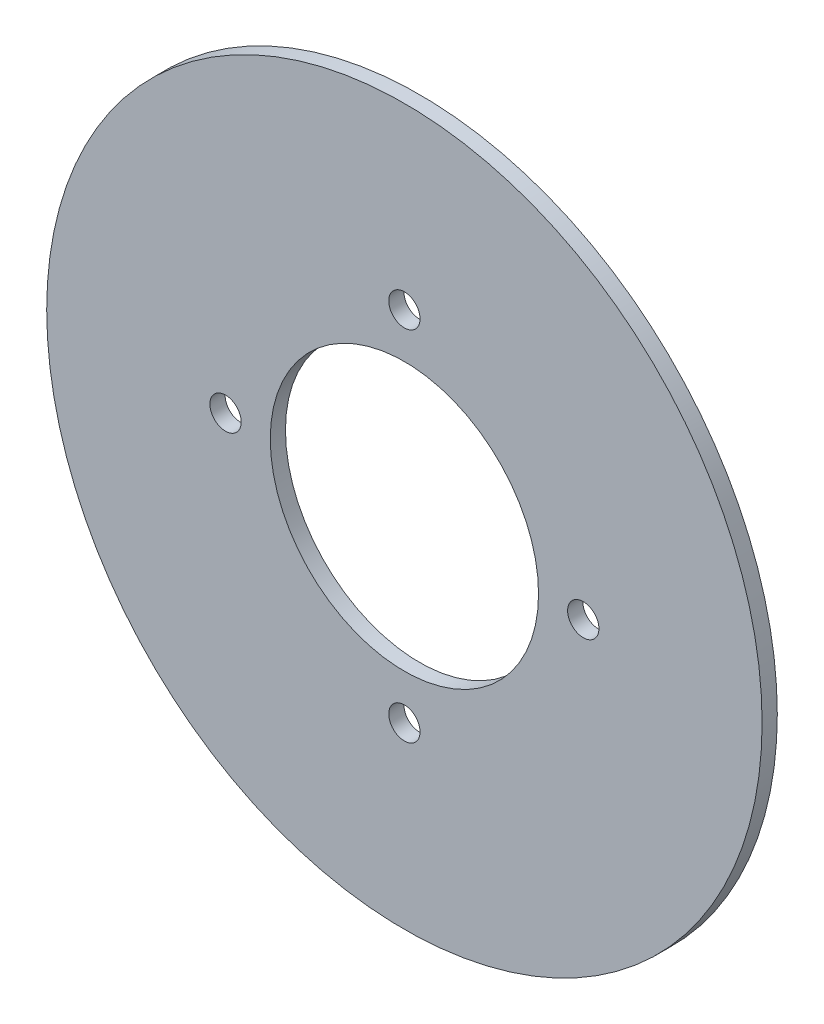
ISO-10303-21;
HEADER;
FILE_DESCRIPTION(('STEP AP214'),'2;1');
FILE_NAME('part.step','',(''),(''),'','','');
FILE_SCHEMA(('AUTOMOTIVE_DESIGN { 1 0 10303 214 1 1 1 1 }'));
ENDSEC;
DATA;
#1=APPLICATION_CONTEXT('core data for automotive mechanical design processes');
#2=APPLICATION_PROTOCOL_DEFINITION('international standard','automotive_design',2000,#1);
#3=PRODUCT_CONTEXT('',#1,'mechanical');
#4=PRODUCT('Part','Part','',(#3));
#5=PRODUCT_RELATED_PRODUCT_CATEGORY('part','',(#4));
#6=PRODUCT_DEFINITION_FORMATION('','',#4);
#7=PRODUCT_DEFINITION_CONTEXT('part definition',#1,'design');
#8=PRODUCT_DEFINITION('design','',#6,#7);
#9=PRODUCT_DEFINITION_SHAPE('','',#8);
#10=(LENGTH_UNIT() NAMED_UNIT(*) SI_UNIT(.MILLI.,.METRE.));
#11=(NAMED_UNIT(*) PLANE_ANGLE_UNIT() SI_UNIT($,.RADIAN.));
#12=(NAMED_UNIT(*) SI_UNIT($,.STERADIAN.) SOLID_ANGLE_UNIT());
#13=UNCERTAINTY_MEASURE_WITH_UNIT(LENGTH_MEASURE(1.E-05),#10,'distance_accuracy_value','');
#14=(GEOMETRIC_REPRESENTATION_CONTEXT(3) GLOBAL_UNCERTAINTY_ASSIGNED_CONTEXT((#13)) GLOBAL_UNIT_ASSIGNED_CONTEXT((#10,
#11,#12)) REPRESENTATION_CONTEXT('',''));
#15=CARTESIAN_POINT('',(0.,0.,0.));
#16=DIRECTION('',(0.,0.,1.));
#17=DIRECTION('',(1.,0.,0.));
#18=AXIS2_PLACEMENT_3D('',#15,#16,#17);
#19=CARTESIAN_POINT('',(0.,0.,1.7));
#20=DIRECTION('',(0.,0.,1.));
#21=DIRECTION('',(1.,0.,0.));
#22=AXIS2_PLACEMENT_3D('',#19,#20,#21);
#23=PLANE('',#22);
#24=CARTESIAN_POINT('',(1.13196979001957E-12,-20.,1.7));
#25=DIRECTION('',(0.,0.,1.));
#26=DIRECTION('',(1.,0.,0.));
#27=AXIS2_PLACEMENT_3D('',#24,#25,#26);
#28=CIRCLE('',#27,1.75000000000122);
#29=CARTESIAN_POINT('',(1.75000000000235,-20.,1.7));
#30=VERTEX_POINT('',#29);
#31=EDGE_CURVE('E61',#30,#30,#28,.T.);
#32=ORIENTED_EDGE('',*,*,#31,.F.);
#33=EDGE_LOOP('',(#32));
#34=FACE_BOUND('',#33,.T.);
#35=CARTESIAN_POINT('',(0.,20.,1.7));
#36=DIRECTION('',(0.,0.,1.));
#37=DIRECTION('',(1.,0.,0.));
#38=AXIS2_PLACEMENT_3D('',#35,#36,#37);
#39=CIRCLE('',#38,1.75);
#40=CARTESIAN_POINT('',(1.75,20.,1.7));
#41=VERTEX_POINT('',#40);
#42=EDGE_CURVE('E49',#41,#41,#39,.T.);
#43=ORIENTED_EDGE('',*,*,#42,.F.);
#44=EDGE_LOOP('',(#43));
#45=FACE_BOUND('',#44,.T.);
#46=CARTESIAN_POINT('',(0.,0.,1.7));
#47=DIRECTION('',(0.,0.,1.));
#48=DIRECTION('',(1.,0.,0.));
#49=AXIS2_PLACEMENT_3D('',#46,#47,#48);
#50=CIRCLE('',#49,40.);
#51=CARTESIAN_POINT('',(40.,0.,1.7));
#52=VERTEX_POINT('',#51);
#53=EDGE_CURVE('E10',#52,#52,#50,.T.);
#54=ORIENTED_EDGE('',*,*,#53,.T.);
#55=EDGE_LOOP('',(#54));
#56=FACE_BOUND('',#55,.T.);
#57=CARTESIAN_POINT('',(0.,0.,1.7));
#58=DIRECTION('',(0.,0.,1.));
#59=DIRECTION('',(1.,0.,0.));
#60=AXIS2_PLACEMENT_3D('',#57,#58,#59);
#61=CIRCLE('',#60,15.);
#62=CARTESIAN_POINT('',(15.,0.,1.7));
#63=VERTEX_POINT('',#62);
#64=EDGE_CURVE('E44',#63,#63,#61,.T.);
#65=ORIENTED_EDGE('',*,*,#64,.F.);
#66=EDGE_LOOP('',(#65));
#67=FACE_BOUND('',#66,.T.);
#68=CARTESIAN_POINT('',(20.,0.,1.7));
#69=DIRECTION('',(0.,0.,1.));
#70=DIRECTION('',(1.,0.,0.));
#71=AXIS2_PLACEMENT_3D('',#68,#69,#70);
#72=CIRCLE('',#71,1.75);
#73=CARTESIAN_POINT('',(21.75,0.,1.7));
#74=VERTEX_POINT('',#73);
#75=EDGE_CURVE('E55',#74,#74,#72,.T.);
#76=ORIENTED_EDGE('',*,*,#75,.F.);
#77=EDGE_LOOP('',(#76));
#78=FACE_BOUND('',#77,.T.);
#79=CARTESIAN_POINT('',(-19.9999999999994,-5.6843418860808E-13,1.7));
#80=DIRECTION('',(0.,0.,1.));
#81=DIRECTION('',(1.,0.,0.));
#82=AXIS2_PLACEMENT_3D('',#79,#80,#81);
#83=CIRCLE('',#82,1.75000000000091);
#84=CARTESIAN_POINT('',(-18.2499999999985,-5.6843418860808E-13,1.7));
#85=VERTEX_POINT('',#84);
#86=EDGE_CURVE('E67',#85,#85,#83,.T.);
#87=ORIENTED_EDGE('',*,*,#86,.F.);
#88=EDGE_LOOP('',(#87));
#89=FACE_BOUND('',#88,.T.);
#90=ADVANCED_FACE('F33',(#34,#45,#56,#67,#78,#89),#23,.T.);
#91=CARTESIAN_POINT('',(0.,0.,0.));
#92=DIRECTION('',(0.,0.,1.));
#93=DIRECTION('',(1.,0.,0.));
#94=AXIS2_PLACEMENT_3D('',#91,#92,#93);
#95=PLANE('',#94);
#96=CARTESIAN_POINT('',(1.13196979001957E-12,-20.,0.));
#97=DIRECTION('',(0.,0.,1.));
#98=DIRECTION('',(1.,0.,0.));
#99=AXIS2_PLACEMENT_3D('',#96,#97,#98);
#100=CIRCLE('',#99,1.75000000000122);
#101=CARTESIAN_POINT('',(1.75000000000235,-20.,0.));
#102=VERTEX_POINT('',#101);
#103=EDGE_CURVE('E64',#102,#102,#100,.T.);
#104=ORIENTED_EDGE('',*,*,#103,.T.);
#105=EDGE_LOOP('',(#104));
#106=FACE_BOUND('',#105,.T.);
#107=CARTESIAN_POINT('',(0.,20.,0.));
#108=DIRECTION('',(0.,0.,1.));
#109=DIRECTION('',(1.,0.,0.));
#110=AXIS2_PLACEMENT_3D('',#107,#108,#109);
#111=CIRCLE('',#110,1.75);
#112=CARTESIAN_POINT('',(1.75,20.,0.));
#113=VERTEX_POINT('',#112);
#114=EDGE_CURVE('E52',#113,#113,#111,.T.);
#115=ORIENTED_EDGE('',*,*,#114,.T.);
#116=EDGE_LOOP('',(#115));
#117=FACE_BOUND('',#116,.T.);
#118=CARTESIAN_POINT('',(0.,0.,0.));
#119=DIRECTION('',(0.,0.,1.));
#120=DIRECTION('',(1.,0.,0.));
#121=AXIS2_PLACEMENT_3D('',#118,#119,#120);
#122=CIRCLE('',#121,40.);
#123=CARTESIAN_POINT('',(40.,0.,0.));
#124=VERTEX_POINT('',#123);
#125=EDGE_CURVE('E37',#124,#124,#122,.T.);
#126=ORIENTED_EDGE('',*,*,#125,.F.);
#127=EDGE_LOOP('',(#126));
#128=FACE_BOUND('',#127,.T.);
#129=CARTESIAN_POINT('',(0.,0.,0.));
#130=DIRECTION('',(0.,0.,1.));
#131=DIRECTION('',(1.,0.,0.));
#132=AXIS2_PLACEMENT_3D('',#129,#130,#131);
#133=CIRCLE('',#132,15.);
#134=CARTESIAN_POINT('',(15.,0.,0.));
#135=VERTEX_POINT('',#134);
#136=EDGE_CURVE('E46',#135,#135,#133,.T.);
#137=ORIENTED_EDGE('',*,*,#136,.T.);
#138=EDGE_LOOP('',(#137));
#139=FACE_BOUND('',#138,.T.);
#140=CARTESIAN_POINT('',(20.,0.,0.));
#141=DIRECTION('',(0.,0.,1.));
#142=DIRECTION('',(1.,0.,0.));
#143=AXIS2_PLACEMENT_3D('',#140,#141,#142);
#144=CIRCLE('',#143,1.75);
#145=CARTESIAN_POINT('',(21.75,0.,0.));
#146=VERTEX_POINT('',#145);
#147=EDGE_CURVE('E58',#146,#146,#144,.T.);
#148=ORIENTED_EDGE('',*,*,#147,.T.);
#149=EDGE_LOOP('',(#148));
#150=FACE_BOUND('',#149,.T.);
#151=CARTESIAN_POINT('',(-19.9999999999994,-5.6843418860808E-13,0.));
#152=DIRECTION('',(0.,0.,1.));
#153=DIRECTION('',(1.,0.,0.));
#154=AXIS2_PLACEMENT_3D('',#151,#152,#153);
#155=CIRCLE('',#154,1.75000000000091);
#156=CARTESIAN_POINT('',(-18.2499999999985,-5.6843418860808E-13,0.));
#157=VERTEX_POINT('',#156);
#158=EDGE_CURVE('E70',#157,#157,#155,.T.);
#159=ORIENTED_EDGE('',*,*,#158,.T.);
#160=EDGE_LOOP('',(#159));
#161=FACE_BOUND('',#160,.T.);
#162=ADVANCED_FACE('F80',(#106,#117,#128,#139,#150,#161),#95,.F.);
#163=CARTESIAN_POINT('',(0.,0.,1.7));
#164=DIRECTION('',(0.,0.,-1.));
#165=DIRECTION('',(-1.,0.,0.));
#166=AXIS2_PLACEMENT_3D('',#163,#164,#165);
#167=CYLINDRICAL_SURFACE('',#166,40.);
#168=ORIENTED_EDGE('',*,*,#53,.F.);
#169=EDGE_LOOP('',(#168));
#170=FACE_BOUND('',#169,.T.);
#171=ORIENTED_EDGE('',*,*,#125,.T.);
#172=EDGE_LOOP('',(#171));
#173=FACE_BOUND('',#172,.T.);
#174=ADVANCED_FACE('F35',(#170,#173),#167,.T.);
#175=CARTESIAN_POINT('',(0.,0.,1.7));
#176=DIRECTION('',(0.,0.,-1.));
#177=DIRECTION('',(-1.,0.,0.));
#178=AXIS2_PLACEMENT_3D('',#175,#176,#177);
#179=CYLINDRICAL_SURFACE('',#178,15.);
#180=ORIENTED_EDGE('',*,*,#64,.T.);
#181=EDGE_LOOP('',(#180));
#182=FACE_BOUND('',#181,.T.);
#183=ORIENTED_EDGE('',*,*,#136,.F.);
#184=EDGE_LOOP('',(#183));
#185=FACE_BOUND('',#184,.T.);
#186=ADVANCED_FACE('F90',(#182,#185),#179,.F.);
#187=CARTESIAN_POINT('',(0.,20.,1.7));
#188=DIRECTION('',(0.,0.,-1.));
#189=DIRECTION('',(-1.,0.,0.));
#190=AXIS2_PLACEMENT_3D('',#187,#188,#189);
#191=CYLINDRICAL_SURFACE('',#190,1.75);
#192=ORIENTED_EDGE('',*,*,#42,.T.);
#193=EDGE_LOOP('',(#192));
#194=FACE_BOUND('',#193,.T.);
#195=ORIENTED_EDGE('',*,*,#114,.F.);
#196=EDGE_LOOP('',(#195));
#197=FACE_BOUND('',#196,.T.);
#198=ADVANCED_FACE('F93',(#194,#197),#191,.F.);
#199=CARTESIAN_POINT('',(20.,0.,1.7));
#200=DIRECTION('',(0.,0.,-1.));
#201=DIRECTION('',(-1.,0.,0.));
#202=AXIS2_PLACEMENT_3D('',#199,#200,#201);
#203=CYLINDRICAL_SURFACE('',#202,1.75);
#204=ORIENTED_EDGE('',*,*,#75,.T.);
#205=EDGE_LOOP('',(#204));
#206=FACE_BOUND('',#205,.T.);
#207=ORIENTED_EDGE('',*,*,#147,.F.);
#208=EDGE_LOOP('',(#207));
#209=FACE_BOUND('',#208,.T.);
#210=ADVANCED_FACE('F97',(#206,#209),#203,.F.);
#211=CARTESIAN_POINT('',(1.13196979001957E-12,-20.,1.7));
#212=DIRECTION('',(0.,0.,-1.));
#213=DIRECTION('',(-1.,0.,0.));
#214=AXIS2_PLACEMENT_3D('',#211,#212,#213);
#215=CYLINDRICAL_SURFACE('',#214,1.75000000000122);
#216=ORIENTED_EDGE('',*,*,#31,.T.);
#217=EDGE_LOOP('',(#216));
#218=FACE_BOUND('',#217,.T.);
#219=ORIENTED_EDGE('',*,*,#103,.F.);
#220=EDGE_LOOP('',(#219));
#221=FACE_BOUND('',#220,.T.);
#222=ADVANCED_FACE('F101',(#218,#221),#215,.F.);
#223=CARTESIAN_POINT('',(-19.9999999999994,-5.6843418860808E-13,1.7));
#224=DIRECTION('',(0.,0.,-1.));
#225=DIRECTION('',(-1.,0.,0.));
#226=AXIS2_PLACEMENT_3D('',#223,#224,#225);
#227=CYLINDRICAL_SURFACE('',#226,1.75000000000091);
#228=ORIENTED_EDGE('',*,*,#86,.T.);
#229=EDGE_LOOP('',(#228));
#230=FACE_BOUND('',#229,.T.);
#231=ORIENTED_EDGE('',*,*,#158,.F.);
#232=EDGE_LOOP('',(#231));
#233=FACE_BOUND('',#232,.T.);
#234=ADVANCED_FACE('F76',(#230,#233),#227,.F.);
#235=CLOSED_SHELL('',(#90,#162,#174,#186,#198,#210,#222,#234));
#236=MANIFOLD_SOLID_BREP('B2',#235);
#237=ADVANCED_BREP_SHAPE_REPRESENTATION('',(#18,#236),#14);
#238=SHAPE_DEFINITION_REPRESENTATION(#9,#237);
ENDSEC;
END-ISO-10303-21;
